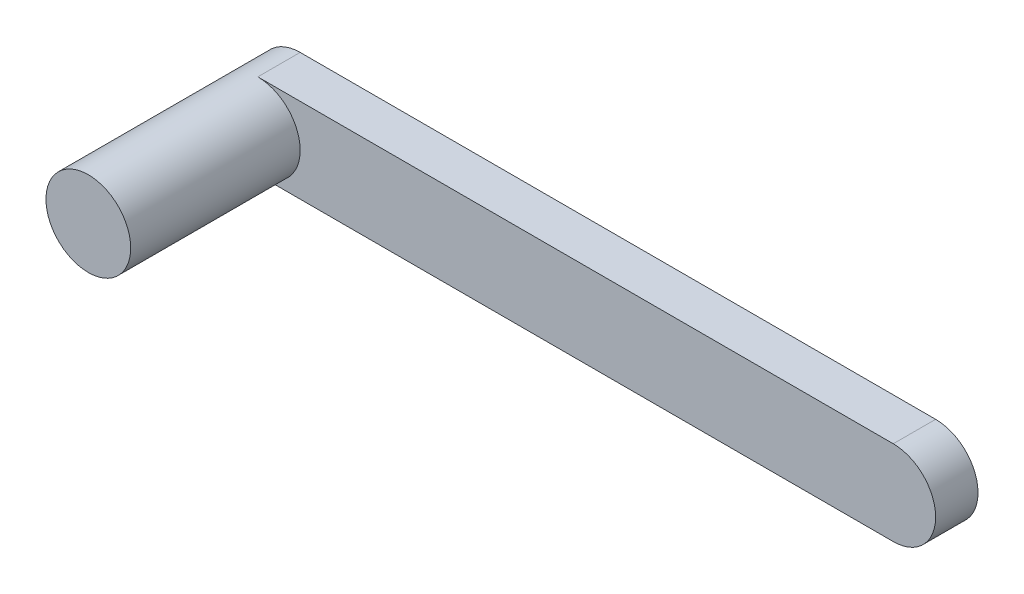
ISO-10303-21;
HEADER;
FILE_DESCRIPTION(('STEP AP214'),'2;1');
FILE_NAME('part.step','',(''),(''),'','','');
FILE_SCHEMA(('AUTOMOTIVE_DESIGN { 1 0 10303 214 1 1 1 1 }'));
ENDSEC;
DATA;
#1=APPLICATION_CONTEXT('core data for automotive mechanical design processes');
#2=APPLICATION_PROTOCOL_DEFINITION('international standard','automotive_design',2000,#1);
#3=PRODUCT_CONTEXT('',#1,'mechanical');
#4=PRODUCT('Part','Part','',(#3));
#5=PRODUCT_RELATED_PRODUCT_CATEGORY('part','',(#4));
#6=PRODUCT_DEFINITION_FORMATION('','',#4);
#7=PRODUCT_DEFINITION_CONTEXT('part definition',#1,'design');
#8=PRODUCT_DEFINITION('design','',#6,#7);
#9=PRODUCT_DEFINITION_SHAPE('','',#8);
#10=(LENGTH_UNIT() NAMED_UNIT(*) SI_UNIT(.MILLI.,.METRE.));
#11=(NAMED_UNIT(*) PLANE_ANGLE_UNIT() SI_UNIT($,.RADIAN.));
#12=(NAMED_UNIT(*) SI_UNIT($,.STERADIAN.) SOLID_ANGLE_UNIT());
#13=UNCERTAINTY_MEASURE_WITH_UNIT(LENGTH_MEASURE(1.E-05),#10,'distance_accuracy_value','');
#14=(GEOMETRIC_REPRESENTATION_CONTEXT(3) GLOBAL_UNCERTAINTY_ASSIGNED_CONTEXT((#13)) GLOBAL_UNIT_ASSIGNED_CONTEXT((#10,
#11,#12)) REPRESENTATION_CONTEXT('',''));
#15=CARTESIAN_POINT('',(0.,0.,0.));
#16=DIRECTION('',(0.,0.,1.));
#17=DIRECTION('',(1.,0.,0.));
#18=AXIS2_PLACEMENT_3D('',#15,#16,#17);
#19=CARTESIAN_POINT('',(0.,0.,2.));
#20=DIRECTION('',(0.,0.,-1.));
#21=DIRECTION('',(-1.,0.,0.));
#22=AXIS2_PLACEMENT_3D('',#19,#20,#21);
#23=CYLINDRICAL_SURFACE('',#22,2.);
#24=CARTESIAN_POINT('',(0.,0.,0.));
#25=DIRECTION('',(0.,0.,1.));
#26=DIRECTION('',(1.,0.,0.));
#27=AXIS2_PLACEMENT_3D('',#24,#25,#26);
#28=CIRCLE('',#27,2.);
#29=CARTESIAN_POINT('',(0.,2.,0.));
#30=VERTEX_POINT('',#29);
#31=CARTESIAN_POINT('',(0.,-2.,0.));
#32=VERTEX_POINT('',#31);
#33=EDGE_CURVE('E98',#30,#32,#28,.T.);
#34=ORIENTED_EDGE('',*,*,#33,.T.);
#35=DIRECTION('',(0.,0.,-1.));
#36=VECTOR('',#35,1.);
#37=CARTESIAN_POINT('',(0.,-2.,2.));
#38=LINE('',#37,#36);
#39=CARTESIAN_POINT('',(0.,-2.,2.));
#40=VERTEX_POINT('',#39);
#41=EDGE_CURVE('E42',#40,#32,#38,.T.);
#42=ORIENTED_EDGE('',*,*,#41,.F.);
#43=CARTESIAN_POINT('',(0.,0.,2.));
#44=DIRECTION('',(0.,0.,1.));
#45=DIRECTION('',(1.,0.,0.));
#46=AXIS2_PLACEMENT_3D('',#43,#44,#45);
#47=CIRCLE('',#46,2.);
#48=CARTESIAN_POINT('',(0.,2.,2.));
#49=VERTEX_POINT('',#48);
#50=EDGE_CURVE('E11',#40,#49,#47,.T.);
#51=ORIENTED_EDGE('',*,*,#50,.T.);
#52=DIRECTION('',(0.,0.,-1.));
#53=VECTOR('',#52,1.);
#54=CARTESIAN_POINT('',(0.,2.,2.));
#55=LINE('',#54,#53);
#56=EDGE_CURVE('E85',#49,#30,#55,.T.);
#57=ORIENTED_EDGE('',*,*,#56,.T.);
#58=EDGE_LOOP('',(#34,#42,#51,#57));
#59=FACE_BOUND('',#58,.T.);
#60=CARTESIAN_POINT('',(0.,0.,10.));
#61=DIRECTION('',(0.,0.,1.));
#62=DIRECTION('',(1.,0.,0.));
#63=AXIS2_PLACEMENT_3D('',#60,#61,#62);
#64=CIRCLE('',#63,2.);
#65=CARTESIAN_POINT('',(2.,0.,10.));
#66=VERTEX_POINT('',#65);
#67=EDGE_CURVE('E109',#66,#66,#64,.T.);
#68=ORIENTED_EDGE('',*,*,#67,.F.);
#69=EDGE_LOOP('',(#68));
#70=FACE_BOUND('',#69,.T.);
#71=ADVANCED_FACE('F39',(#59,#70),#23,.T.);
#72=CARTESIAN_POINT('',(0.,-2.,2.));
#73=DIRECTION('',(0.,1.,0.));
#74=DIRECTION('',(0.,0.,1.));
#75=AXIS2_PLACEMENT_3D('',#72,#73,#74);
#76=PLANE('',#75);
#77=DIRECTION('',(1.,0.,0.));
#78=VECTOR('',#77,1.);
#79=CARTESIAN_POINT('',(0.,-2.,0.));
#80=LINE('',#79,#78);
#81=CARTESIAN_POINT('',(30.,-2.,0.));
#82=VERTEX_POINT('',#81);
#83=EDGE_CURVE('E107',#32,#82,#80,.T.);
#84=ORIENTED_EDGE('',*,*,#83,.T.);
#85=DIRECTION('',(0.,0.,-1.));
#86=VECTOR('',#85,1.);
#87=CARTESIAN_POINT('',(30.,-2.,2.));
#88=LINE('',#87,#86);
#89=CARTESIAN_POINT('',(30.,-2.,2.));
#90=VERTEX_POINT('',#89);
#91=EDGE_CURVE('E100',#90,#82,#88,.T.);
#92=ORIENTED_EDGE('',*,*,#91,.F.);
#93=DIRECTION('',(1.,0.,0.));
#94=VECTOR('',#93,1.);
#95=CARTESIAN_POINT('',(0.,-2.,2.));
#96=LINE('',#95,#94);
#97=EDGE_CURVE('E105',#40,#90,#96,.T.);
#98=ORIENTED_EDGE('',*,*,#97,.F.);
#99=ORIENTED_EDGE('',*,*,#41,.T.);
#100=EDGE_LOOP('',(#84,#92,#98,#99));
#101=FACE_BOUND('',#100,.T.);
#102=ADVANCED_FACE('F118',(#101),#76,.F.);
#103=CARTESIAN_POINT('',(30.,0.,2.));
#104=DIRECTION('',(0.,0.,-1.));
#105=DIRECTION('',(-1.,0.,0.));
#106=AXIS2_PLACEMENT_3D('',#103,#104,#105);
#107=CYLINDRICAL_SURFACE('',#106,2.);
#108=CARTESIAN_POINT('',(30.,0.,0.));
#109=DIRECTION('',(0.,0.,1.));
#110=DIRECTION('',(1.,0.,0.));
#111=AXIS2_PLACEMENT_3D('',#108,#109,#110);
#112=CIRCLE('',#111,2.);
#113=CARTESIAN_POINT('',(30.,2.,0.));
#114=VERTEX_POINT('',#113);
#115=EDGE_CURVE('E73',#82,#114,#112,.T.);
#116=ORIENTED_EDGE('',*,*,#115,.T.);
#117=DIRECTION('',(0.,0.,-1.));
#118=VECTOR('',#117,1.);
#119=CARTESIAN_POINT('',(30.,2.,2.));
#120=LINE('',#119,#118);
#121=CARTESIAN_POINT('',(30.,2.,2.));
#122=VERTEX_POINT('',#121);
#123=EDGE_CURVE('E91',#122,#114,#120,.T.);
#124=ORIENTED_EDGE('',*,*,#123,.F.);
#125=CARTESIAN_POINT('',(30.,0.,2.));
#126=DIRECTION('',(0.,0.,1.));
#127=DIRECTION('',(1.,0.,0.));
#128=AXIS2_PLACEMENT_3D('',#125,#126,#127);
#129=CIRCLE('',#128,2.);
#130=EDGE_CURVE('E56',#90,#122,#129,.T.);
#131=ORIENTED_EDGE('',*,*,#130,.F.);
#132=ORIENTED_EDGE('',*,*,#91,.T.);
#133=EDGE_LOOP('',(#116,#124,#131,#132));
#134=FACE_BOUND('',#133,.T.);
#135=ADVANCED_FACE('F123',(#134),#107,.T.);
#136=CARTESIAN_POINT('',(0.,2.,2.));
#137=DIRECTION('',(0.,-1.,0.));
#138=DIRECTION('',(0.,0.,-1.));
#139=AXIS2_PLACEMENT_3D('',#136,#137,#138);
#140=PLANE('',#139);
#141=DIRECTION('',(-1.,0.,0.));
#142=VECTOR('',#141,1.);
#143=CARTESIAN_POINT('',(0.,2.,0.));
#144=LINE('',#143,#142);
#145=EDGE_CURVE('E79',#114,#30,#144,.T.);
#146=ORIENTED_EDGE('',*,*,#145,.T.);
#147=ORIENTED_EDGE('',*,*,#56,.F.);
#148=DIRECTION('',(-1.,0.,0.));
#149=VECTOR('',#148,1.);
#150=CARTESIAN_POINT('',(0.,2.,2.));
#151=LINE('',#150,#149);
#152=EDGE_CURVE('E87',#122,#49,#151,.T.);
#153=ORIENTED_EDGE('',*,*,#152,.F.);
#154=ORIENTED_EDGE('',*,*,#123,.T.);
#155=EDGE_LOOP('',(#146,#147,#153,#154));
#156=FACE_BOUND('',#155,.T.);
#157=ADVANCED_FACE('F86',(#156),#140,.F.);
#158=CARTESIAN_POINT('',(0.,0.,2.));
#159=DIRECTION('',(0.,0.,1.));
#160=DIRECTION('',(1.,0.,0.));
#161=AXIS2_PLACEMENT_3D('',#158,#159,#160);
#162=PLANE('',#161);
#163=ORIENTED_EDGE('',*,*,#50,.F.);
#164=ORIENTED_EDGE('',*,*,#97,.T.);
#165=ORIENTED_EDGE('',*,*,#130,.T.);
#166=ORIENTED_EDGE('',*,*,#152,.T.);
#167=EDGE_LOOP('',(#163,#164,#165,#166));
#168=FACE_BOUND('',#167,.T.);
#169=ADVANCED_FACE('F93',(#168),#162,.T.);
#170=CARTESIAN_POINT('',(0.,0.,0.));
#171=DIRECTION('',(0.,0.,1.));
#172=DIRECTION('',(1.,0.,0.));
#173=AXIS2_PLACEMENT_3D('',#170,#171,#172);
#174=PLANE('',#173);
#175=ORIENTED_EDGE('',*,*,#33,.F.);
#176=ORIENTED_EDGE('',*,*,#145,.F.);
#177=ORIENTED_EDGE('',*,*,#115,.F.);
#178=ORIENTED_EDGE('',*,*,#83,.F.);
#179=EDGE_LOOP('',(#175,#176,#177,#178));
#180=FACE_BOUND('',#179,.T.);
#181=ADVANCED_FACE('F132',(#180),#174,.F.);
#182=CARTESIAN_POINT('',(0.,0.,10.));
#183=DIRECTION('',(0.,0.,1.));
#184=DIRECTION('',(1.,0.,0.));
#185=AXIS2_PLACEMENT_3D('',#182,#183,#184);
#186=PLANE('',#185);
#187=ORIENTED_EDGE('',*,*,#67,.T.);
#188=EDGE_LOOP('',(#187));
#189=FACE_BOUND('',#188,.T.);
#190=ADVANCED_FACE('F116',(#189),#186,.T.);
#191=CLOSED_SHELL('',(#71,#102,#135,#157,#169,#181,#190));
#192=MANIFOLD_SOLID_BREP('B2',#191);
#193=ADVANCED_BREP_SHAPE_REPRESENTATION('',(#18,#192),#14);
#194=SHAPE_DEFINITION_REPRESENTATION(#9,#193);
ENDSEC;
END-ISO-10303-21;
